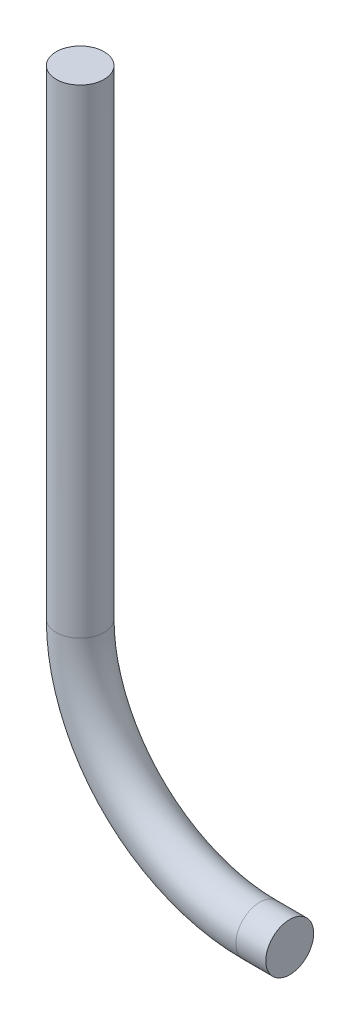
ISO-10303-21;
HEADER;
FILE_DESCRIPTION(('STEP AP214'),'2;1');
FILE_NAME('part.step','',(''),(''),'','','');
FILE_SCHEMA(('AUTOMOTIVE_DESIGN { 1 0 10303 214 1 1 1 1 }'));
ENDSEC;
DATA;
#1=APPLICATION_CONTEXT('core data for automotive mechanical design processes');
#2=APPLICATION_PROTOCOL_DEFINITION('international standard','automotive_design',2000,#1);
#3=PRODUCT_CONTEXT('',#1,'mechanical');
#4=PRODUCT('Part','Part','',(#3));
#5=PRODUCT_RELATED_PRODUCT_CATEGORY('part','',(#4));
#6=PRODUCT_DEFINITION_FORMATION('','',#4);
#7=PRODUCT_DEFINITION_CONTEXT('part definition',#1,'design');
#8=PRODUCT_DEFINITION('design','',#6,#7);
#9=PRODUCT_DEFINITION_SHAPE('','',#8);
#10=(LENGTH_UNIT() NAMED_UNIT(*) SI_UNIT(.MILLI.,.METRE.));
#11=(NAMED_UNIT(*) PLANE_ANGLE_UNIT() SI_UNIT($,.RADIAN.));
#12=(NAMED_UNIT(*) SI_UNIT($,.STERADIAN.) SOLID_ANGLE_UNIT());
#13=UNCERTAINTY_MEASURE_WITH_UNIT(LENGTH_MEASURE(1.E-05),#10,'distance_accuracy_value','');
#14=(GEOMETRIC_REPRESENTATION_CONTEXT(3) GLOBAL_UNCERTAINTY_ASSIGNED_CONTEXT((#13)) GLOBAL_UNIT_ASSIGNED_CONTEXT((#10,
#11,#12)) REPRESENTATION_CONTEXT('',''));
#15=CARTESIAN_POINT('',(0.,0.,0.));
#16=DIRECTION('',(0.,0.,1.));
#17=DIRECTION('',(1.,0.,0.));
#18=AXIS2_PLACEMENT_3D('',#15,#16,#17);
#19=CARTESIAN_POINT('',(0.,0.,0.));
#20=DIRECTION('',(1.,0.,0.));
#21=DIRECTION('',(0.,0.,-1.));
#22=AXIS2_PLACEMENT_3D('',#19,#20,#21);
#23=PLANE('',#22);
#24=CARTESIAN_POINT('',(0.,0.,0.));
#25=DIRECTION('',(1.,0.,0.));
#26=DIRECTION('',(0.,0.,-1.));
#27=AXIS2_PLACEMENT_3D('',#24,#25,#26);
#28=CIRCLE('',#27,4.);
#29=CARTESIAN_POINT('',(0.,0.,-4.));
#30=VERTEX_POINT('',#29);
#31=EDGE_CURVE('E51',#30,#30,#28,.T.);
#32=ORIENTED_EDGE('',*,*,#31,.T.);
#33=EDGE_LOOP('',(#32));
#34=FACE_BOUND('',#33,.T.);
#35=ADVANCED_FACE('F33',(#34),#23,.T.);
#36=CARTESIAN_POINT('',(-35.,110.,0.));
#37=DIRECTION('',(0.,-1.,0.));
#38=DIRECTION('',(0.,0.,-1.));
#39=AXIS2_PLACEMENT_3D('',#36,#37,#38);
#40=PLANE('',#39);
#41=CARTESIAN_POINT('',(-35.,110.,0.));
#42=DIRECTION('',(0.,-1.,0.));
#43=DIRECTION('',(0.,0.,-1.));
#44=AXIS2_PLACEMENT_3D('',#41,#42,#43);
#45=CIRCLE('',#44,4.);
#46=CARTESIAN_POINT('',(-35.,110.,-4.));
#47=VERTEX_POINT('',#46);
#48=EDGE_CURVE('E10',#47,#47,#45,.T.);
#49=ORIENTED_EDGE('',*,*,#48,.F.);
#50=EDGE_LOOP('',(#49));
#51=FACE_BOUND('',#50,.T.);
#52=ADVANCED_FACE('F61',(#51),#40,.F.);
#53=CARTESIAN_POINT('',(0.,0.,0.));
#54=DIRECTION('',(-1.,0.,0.));
#55=DIRECTION('',(0.,-1.,0.));
#56=AXIS2_PLACEMENT_3D('',#53,#54,#55);
#57=CYLINDRICAL_SURFACE('',#56,4.);
#58=CARTESIAN_POINT('',(-5.,0.,0.));
#59=DIRECTION('',(1.,0.,0.));
#60=DIRECTION('',(0.,0.,-1.));
#61=AXIS2_PLACEMENT_3D('',#58,#59,#60);
#62=CIRCLE('',#61,4.);
#63=CARTESIAN_POINT('',(-5.,-4.,0.));
#64=VERTEX_POINT('',#63);
#65=EDGE_CURVE('E46',#64,#64,#62,.T.);
#66=ORIENTED_EDGE('',*,*,#65,.T.);
#67=EDGE_LOOP('',(#66));
#68=FACE_BOUND('',#67,.T.);
#69=ORIENTED_EDGE('',*,*,#31,.F.);
#70=EDGE_LOOP('',(#69));
#71=FACE_BOUND('',#70,.T.);
#72=ADVANCED_FACE('F58',(#68,#71),#57,.T.);
#73=CARTESIAN_POINT('',(-5.,30.,0.));
#74=DIRECTION('',(0.,0.,-1.));
#75=DIRECTION('',(-1.,0.,0.));
#76=AXIS2_PLACEMENT_3D('',#73,#74,#75);
#77=TOROIDAL_SURFACE('',#76,30.,4.);
#78=CARTESIAN_POINT('',(-35.,30.,0.));
#79=DIRECTION('',(0.,-1.,0.));
#80=DIRECTION('',(0.,0.,-1.));
#81=AXIS2_PLACEMENT_3D('',#78,#79,#80);
#82=CIRCLE('',#81,4.);
#83=CARTESIAN_POINT('',(-39.,30.,0.));
#84=VERTEX_POINT('',#83);
#85=EDGE_CURVE('E40',#84,#84,#82,.T.);
#86=CARTESIAN_POINT('',(-5.,30.,0.));
#87=DIRECTION('',(0.,0.,-1.));
#88=DIRECTION('',(-1.,0.,0.));
#89=AXIS2_PLACEMENT_3D('',#86,#87,#88);
#90=CIRCLE('',#89,34.);
#91=EDGE_CURVE('',#64,#84,#90,.T.);
#92=ORIENTED_EDGE('',*,*,#65,.F.);
#93=ORIENTED_EDGE('',*,*,#85,.T.);
#94=ORIENTED_EDGE('',*,*,#91,.T.);
#95=ORIENTED_EDGE('',*,*,#91,.F.);
#96=EDGE_LOOP('',(#92,#94,#93,#95));
#97=FACE_BOUND('',#96,.T.);
#98=ADVANCED_FACE('F60',(#97),#77,.T.);
#99=CARTESIAN_POINT('',(-35.,30.,0.));
#100=DIRECTION('',(0.,1.,0.));
#101=DIRECTION('',(0.,0.,1.));
#102=AXIS2_PLACEMENT_3D('',#99,#100,#101);
#103=CYLINDRICAL_SURFACE('',#102,4.);
#104=ORIENTED_EDGE('',*,*,#48,.T.);
#105=EDGE_LOOP('',(#104));
#106=FACE_BOUND('',#105,.T.);
#107=ORIENTED_EDGE('',*,*,#85,.F.);
#108=EDGE_LOOP('',(#107));
#109=FACE_BOUND('',#108,.T.);
#110=ADVANCED_FACE('F68',(#106,#109),#103,.T.);
#111=CLOSED_SHELL('',(#35,#52,#72,#98,#110));
#112=MANIFOLD_SOLID_BREP('B2',#111);
#113=ADVANCED_BREP_SHAPE_REPRESENTATION('',(#18,#112),#14);
#114=SHAPE_DEFINITION_REPRESENTATION(#9,#113);
ENDSEC;
END-ISO-10303-21;
